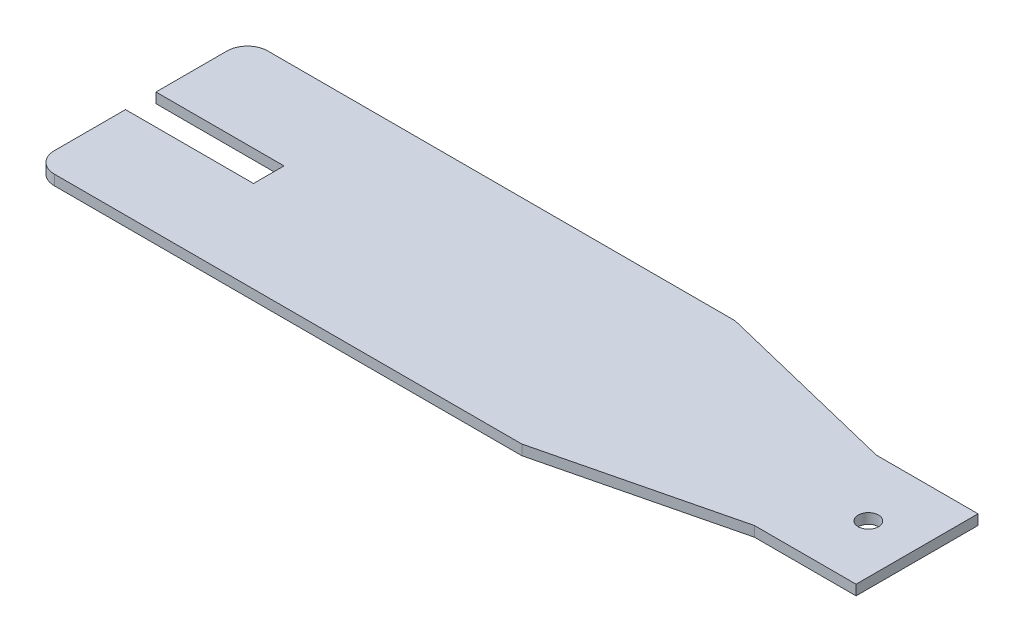
ISO-10303-21;
HEADER;
FILE_DESCRIPTION(('STEP AP214'),'2;1');
FILE_NAME('part.step','',(''),(''),'','','');
FILE_SCHEMA(('AUTOMOTIVE_DESIGN { 1 0 10303 214 1 1 1 1 }'));
ENDSEC;
DATA;
#1=APPLICATION_CONTEXT('core data for automotive mechanical design processes');
#2=APPLICATION_PROTOCOL_DEFINITION('international standard','automotive_design',2000,#1);
#3=PRODUCT_CONTEXT('',#1,'mechanical');
#4=PRODUCT('Part','Part','',(#3));
#5=PRODUCT_RELATED_PRODUCT_CATEGORY('part','',(#4));
#6=PRODUCT_DEFINITION_FORMATION('','',#4);
#7=PRODUCT_DEFINITION_CONTEXT('part definition',#1,'design');
#8=PRODUCT_DEFINITION('design','',#6,#7);
#9=PRODUCT_DEFINITION_SHAPE('','',#8);
#10=(LENGTH_UNIT() NAMED_UNIT(*) SI_UNIT(.MILLI.,.METRE.));
#11=(NAMED_UNIT(*) PLANE_ANGLE_UNIT() SI_UNIT($,.RADIAN.));
#12=(NAMED_UNIT(*) SI_UNIT($,.STERADIAN.) SOLID_ANGLE_UNIT());
#13=UNCERTAINTY_MEASURE_WITH_UNIT(LENGTH_MEASURE(1.E-05),#10,'distance_accuracy_value','');
#14=(GEOMETRIC_REPRESENTATION_CONTEXT(3) GLOBAL_UNCERTAINTY_ASSIGNED_CONTEXT((#13)) GLOBAL_UNIT_ASSIGNED_CONTEXT((#10,
#11,#12)) REPRESENTATION_CONTEXT('',''));
#15=CARTESIAN_POINT('',(0.,0.,0.));
#16=DIRECTION('',(0.,0.,1.));
#17=DIRECTION('',(1.,0.,0.));
#18=AXIS2_PLACEMENT_3D('',#15,#16,#17);
#19=CARTESIAN_POINT('',(-181.,5.,52.1044776119404));
#20=DIRECTION('',(0.,-1.,0.));
#21=DIRECTION('',(0.,0.,-1.));
#22=AXIS2_PLACEMENT_3D('',#19,#20,#21);
#23=PLANE('',#22);
#24=CARTESIAN_POINT('',(-181.,5.,52.1044776119404));
#25=DIRECTION('',(0.,1.,0.));
#26=DIRECTION('',(0.,0.,-1.));
#27=AXIS2_PLACEMENT_3D('',#24,#25,#26);
#28=CIRCLE('',#27,10.);
#29=CARTESIAN_POINT('',(-191.,5.,52.1044776119404));
#30=VERTEX_POINT('',#29);
#31=CARTESIAN_POINT('',(-181.,5.,62.1044776119404));
#32=VERTEX_POINT('',#31);
#33=EDGE_CURVE('E218',#30,#32,#28,.T.);
#34=ORIENTED_EDGE('',*,*,#33,.T.);
#35=DIRECTION('',(1.,0.,0.));
#36=VECTOR('',#35,1.);
#37=CARTESIAN_POINT('',(49.0000000000002,5.,62.1044776119404));
#38=LINE('',#37,#36);
#39=CARTESIAN_POINT('',(49.0000000000002,5.,62.1044776119404));
#40=VERTEX_POINT('',#39);
#41=EDGE_CURVE('E118',#32,#40,#38,.T.);
#42=ORIENTED_EDGE('',*,*,#41,.T.);
#43=DIRECTION('',(0.971371940007968,0.,-0.237563789675862));
#44=VECTOR('',#43,1.);
#45=CARTESIAN_POINT('',(141.,5.,39.6044776119404));
#46=LINE('',#45,#44);
#47=CARTESIAN_POINT('',(141.,5.,39.6044776119404));
#48=VERTEX_POINT('',#47);
#49=EDGE_CURVE('E263',#40,#48,#46,.T.);
#50=ORIENTED_EDGE('',*,*,#49,.T.);
#51=DIRECTION('',(1.,0.,0.));
#52=VECTOR('',#51,1.);
#53=CARTESIAN_POINT('',(191.,5.,39.6044776119404));
#54=LINE('',#53,#52);
#55=CARTESIAN_POINT('',(191.,5.,39.6044776119404));
#56=VERTEX_POINT('',#55);
#57=EDGE_CURVE('E283',#48,#56,#54,.T.);
#58=ORIENTED_EDGE('',*,*,#57,.T.);
#59=DIRECTION('',(0.,0.,-1.));
#60=VECTOR('',#59,1.);
#61=CARTESIAN_POINT('',(191.,5.,39.6044776119404));
#62=LINE('',#61,#60);
#63=CARTESIAN_POINT('',(191.,5.,-20.3955223880596));
#64=VERTEX_POINT('',#63);
#65=EDGE_CURVE('E279',#56,#64,#62,.T.);
#66=ORIENTED_EDGE('',*,*,#65,.T.);
#67=DIRECTION('',(-1.,0.,0.));
#68=VECTOR('',#67,1.);
#69=CARTESIAN_POINT('',(191.,5.,-20.3955223880596));
#70=LINE('',#69,#68);
#71=CARTESIAN_POINT('',(141.,5.,-20.3955223880596));
#72=VERTEX_POINT('',#71);
#73=EDGE_CURVE('E282',#64,#72,#70,.T.);
#74=ORIENTED_EDGE('',*,*,#73,.T.);
#75=DIRECTION('',(-0.971371940007968,0.,-0.237563789675862));
#76=VECTOR('',#75,1.);
#77=CARTESIAN_POINT('',(141.,5.,-20.3955223880596));
#78=LINE('',#77,#76);
#79=CARTESIAN_POINT('',(49.0000000000002,5.,-42.8955223880596));
#80=VERTEX_POINT('',#79);
#81=EDGE_CURVE('E287',#72,#80,#78,.T.);
#82=ORIENTED_EDGE('',*,*,#81,.T.);
#83=DIRECTION('',(-1.,0.,0.));
#84=VECTOR('',#83,1.);
#85=CARTESIAN_POINT('',(49.0000000000002,5.,-42.8955223880596));
#86=LINE('',#85,#84);
#87=CARTESIAN_POINT('',(-181.,5.,-42.8955223880596));
#88=VERTEX_POINT('',#87);
#89=EDGE_CURVE('E294',#80,#88,#86,.T.);
#90=ORIENTED_EDGE('',*,*,#89,.T.);
#91=CARTESIAN_POINT('',(-181.,5.,-32.8955223880596));
#92=DIRECTION('',(0.,1.,0.));
#93=DIRECTION('',(0.,0.,1.));
#94=AXIS2_PLACEMENT_3D('',#91,#92,#93);
#95=CIRCLE('',#94,10.);
#96=CARTESIAN_POINT('',(-191.,5.,-32.8955223880596));
#97=VERTEX_POINT('',#96);
#98=EDGE_CURVE('E297',#88,#97,#95,.T.);
#99=ORIENTED_EDGE('',*,*,#98,.T.);
#100=DIRECTION('',(0.,0.,1.));
#101=VECTOR('',#100,1.);
#102=CARTESIAN_POINT('',(-191.,5.,2.10447761194041));
#103=LINE('',#102,#101);
#104=CARTESIAN_POINT('',(-191.,5.,2.10447761194041));
#105=VERTEX_POINT('',#104);
#106=EDGE_CURVE('E300',#97,#105,#103,.T.);
#107=ORIENTED_EDGE('',*,*,#106,.T.);
#108=DIRECTION('',(1.,0.,0.));
#109=VECTOR('',#108,1.);
#110=CARTESIAN_POINT('',(-191.,5.,2.10447761194041));
#111=LINE('',#110,#109);
#112=CARTESIAN_POINT('',(-128.,5.,2.10447761194041));
#113=VERTEX_POINT('',#112);
#114=EDGE_CURVE('E155',#105,#113,#111,.T.);
#115=ORIENTED_EDGE('',*,*,#114,.T.);
#116=DIRECTION('',(0.,0.,1.));
#117=VECTOR('',#116,1.);
#118=CARTESIAN_POINT('',(-128.,5.,2.10447761194041));
#119=LINE('',#118,#117);
#120=CARTESIAN_POINT('',(-128.,5.,17.1044776119404));
#121=VERTEX_POINT('',#120);
#122=EDGE_CURVE('E149',#113,#121,#119,.T.);
#123=ORIENTED_EDGE('',*,*,#122,.T.);
#124=DIRECTION('',(-1.,0.,0.));
#125=VECTOR('',#124,1.);
#126=CARTESIAN_POINT('',(-191.,5.,17.1044776119404));
#127=LINE('',#126,#125);
#128=CARTESIAN_POINT('',(-191.,5.,17.1044776119404));
#129=VERTEX_POINT('',#128);
#130=EDGE_CURVE('E153',#121,#129,#127,.T.);
#131=ORIENTED_EDGE('',*,*,#130,.T.);
#132=DIRECTION('',(0.,0.,1.));
#133=VECTOR('',#132,1.);
#134=CARTESIAN_POINT('',(-191.,5.,52.1044776119404));
#135=LINE('',#134,#133);
#136=EDGE_CURVE('E57',#129,#30,#135,.T.);
#137=ORIENTED_EDGE('',*,*,#136,.T.);
#138=EDGE_LOOP('',(#34,#42,#50,#58,#66,#74,#82,#90,#99,#107,#115,#123,#131,#137));
#139=FACE_BOUND('',#138,.T.);
#140=CARTESIAN_POINT('',(167.053731343284,5.,9.60447761194041));
#141=DIRECTION('',(0.,1.,0.));
#142=DIRECTION('',(0.,0.,1.));
#143=AXIS2_PLACEMENT_3D('',#140,#141,#142);
#144=CIRCLE('',#143,4.99999999999999);
#145=CARTESIAN_POINT('',(167.053731343284,5.,14.6044776119404));
#146=VERTEX_POINT('',#145);
#147=EDGE_CURVE('E182',#146,#146,#144,.T.);
#148=ORIENTED_EDGE('',*,*,#147,.F.);
#149=EDGE_LOOP('',(#148));
#150=FACE_BOUND('',#149,.T.);
#151=ADVANCED_FACE('F39',(#139,#150),#23,.F.);
#152=CARTESIAN_POINT('',(-181.,0.,52.1044776119404));
#153=DIRECTION('',(0.,-1.,0.));
#154=DIRECTION('',(0.,0.,-1.));
#155=AXIS2_PLACEMENT_3D('',#152,#153,#154);
#156=PLANE('',#155);
#157=CARTESIAN_POINT('',(-181.,0.,52.1044776119404));
#158=DIRECTION('',(0.,1.,0.));
#159=DIRECTION('',(0.,0.,-1.));
#160=AXIS2_PLACEMENT_3D('',#157,#158,#159);
#161=CIRCLE('',#160,10.);
#162=CARTESIAN_POINT('',(-191.,0.,52.1044776119404));
#163=VERTEX_POINT('',#162);
#164=CARTESIAN_POINT('',(-181.,0.,62.1044776119404));
#165=VERTEX_POINT('',#164);
#166=EDGE_CURVE('E177',#163,#165,#161,.T.);
#167=ORIENTED_EDGE('',*,*,#166,.F.);
#168=DIRECTION('',(0.,0.,1.));
#169=VECTOR('',#168,1.);
#170=CARTESIAN_POINT('',(-191.,0.,52.1044776119404));
#171=LINE('',#170,#169);
#172=CARTESIAN_POINT('',(-191.,0.,17.1044776119404));
#173=VERTEX_POINT('',#172);
#174=EDGE_CURVE('E110',#173,#163,#171,.T.);
#175=ORIENTED_EDGE('',*,*,#174,.F.);
#176=DIRECTION('',(-1.,0.,0.));
#177=VECTOR('',#176,1.);
#178=CARTESIAN_POINT('',(-191.,0.,17.1044776119404));
#179=LINE('',#178,#177);
#180=CARTESIAN_POINT('',(-128.,0.,17.1044776119404));
#181=VERTEX_POINT('',#180);
#182=EDGE_CURVE('E104',#181,#173,#179,.T.);
#183=ORIENTED_EDGE('',*,*,#182,.F.);
#184=DIRECTION('',(0.,0.,1.));
#185=VECTOR('',#184,1.);
#186=CARTESIAN_POINT('',(-128.,0.,2.10447761194041));
#187=LINE('',#186,#185);
#188=CARTESIAN_POINT('',(-128.,0.,2.10447761194041));
#189=VERTEX_POINT('',#188);
#190=EDGE_CURVE('E164',#189,#181,#187,.T.);
#191=ORIENTED_EDGE('',*,*,#190,.F.);
#192=DIRECTION('',(1.,0.,0.));
#193=VECTOR('',#192,1.);
#194=CARTESIAN_POINT('',(-191.,0.,2.10447761194041));
#195=LINE('',#194,#193);
#196=CARTESIAN_POINT('',(-191.,0.,2.10447761194041));
#197=VERTEX_POINT('',#196);
#198=EDGE_CURVE('E209',#197,#189,#195,.T.);
#199=ORIENTED_EDGE('',*,*,#198,.F.);
#200=DIRECTION('',(0.,0.,1.));
#201=VECTOR('',#200,1.);
#202=CARTESIAN_POINT('',(-191.,0.,2.10447761194041));
#203=LINE('',#202,#201);
#204=CARTESIAN_POINT('',(-191.,0.,-32.8955223880596));
#205=VERTEX_POINT('',#204);
#206=EDGE_CURVE('E206',#205,#197,#203,.T.);
#207=ORIENTED_EDGE('',*,*,#206,.F.);
#208=CARTESIAN_POINT('',(-181.,0.,-32.8955223880596));
#209=DIRECTION('',(0.,1.,0.));
#210=DIRECTION('',(0.,0.,1.));
#211=AXIS2_PLACEMENT_3D('',#208,#209,#210);
#212=CIRCLE('',#211,10.);
#213=CARTESIAN_POINT('',(-181.,0.,-42.8955223880596));
#214=VERTEX_POINT('',#213);
#215=EDGE_CURVE('E203',#214,#205,#212,.T.);
#216=ORIENTED_EDGE('',*,*,#215,.F.);
#217=DIRECTION('',(-1.,0.,0.));
#218=VECTOR('',#217,1.);
#219=CARTESIAN_POINT('',(49.0000000000002,0.,-42.8955223880596));
#220=LINE('',#219,#218);
#221=CARTESIAN_POINT('',(49.0000000000002,0.,-42.8955223880596));
#222=VERTEX_POINT('',#221);
#223=EDGE_CURVE('E200',#222,#214,#220,.T.);
#224=ORIENTED_EDGE('',*,*,#223,.F.);
#225=DIRECTION('',(-0.971371940007968,0.,-0.237563789675862));
#226=VECTOR('',#225,1.);
#227=CARTESIAN_POINT('',(141.,0.,-20.3955223880596));
#228=LINE('',#227,#226);
#229=CARTESIAN_POINT('',(141.,0.,-20.3955223880596));
#230=VERTEX_POINT('',#229);
#231=EDGE_CURVE('E197',#230,#222,#228,.T.);
#232=ORIENTED_EDGE('',*,*,#231,.F.);
#233=DIRECTION('',(-1.,0.,0.));
#234=VECTOR('',#233,1.);
#235=CARTESIAN_POINT('',(191.,0.,-20.3955223880596));
#236=LINE('',#235,#234);
#237=CARTESIAN_POINT('',(191.,0.,-20.3955223880596));
#238=VERTEX_POINT('',#237);
#239=EDGE_CURVE('E194',#238,#230,#236,.T.);
#240=ORIENTED_EDGE('',*,*,#239,.F.);
#241=DIRECTION('',(0.,0.,-1.));
#242=VECTOR('',#241,1.);
#243=CARTESIAN_POINT('',(191.,0.,39.6044776119404));
#244=LINE('',#243,#242);
#245=CARTESIAN_POINT('',(191.,0.,39.6044776119404));
#246=VERTEX_POINT('',#245);
#247=EDGE_CURVE('E191',#246,#238,#244,.T.);
#248=ORIENTED_EDGE('',*,*,#247,.F.);
#249=DIRECTION('',(1.,0.,0.));
#250=VECTOR('',#249,1.);
#251=CARTESIAN_POINT('',(191.,0.,39.6044776119404));
#252=LINE('',#251,#250);
#253=CARTESIAN_POINT('',(141.,0.,39.6044776119404));
#254=VERTEX_POINT('',#253);
#255=EDGE_CURVE('E188',#254,#246,#252,.T.);
#256=ORIENTED_EDGE('',*,*,#255,.F.);
#257=DIRECTION('',(0.971371940007968,0.,-0.237563789675862));
#258=VECTOR('',#257,1.);
#259=CARTESIAN_POINT('',(141.,0.,39.6044776119404));
#260=LINE('',#259,#258);
#261=CARTESIAN_POINT('',(49.0000000000002,0.,62.1044776119404));
#262=VERTEX_POINT('',#261);
#263=EDGE_CURVE('E185',#262,#254,#260,.T.);
#264=ORIENTED_EDGE('',*,*,#263,.F.);
#265=DIRECTION('',(1.,0.,0.));
#266=VECTOR('',#265,1.);
#267=CARTESIAN_POINT('',(49.0000000000002,0.,62.1044776119404));
#268=LINE('',#267,#266);
#269=EDGE_CURVE('E181',#165,#262,#268,.T.);
#270=ORIENTED_EDGE('',*,*,#269,.F.);
#271=EDGE_LOOP('',(#167,#175,#183,#191,#199,#207,#216,#224,#232,#240,#248,#256,#264,#270));
#272=FACE_BOUND('',#271,.T.);
#273=CARTESIAN_POINT('',(167.053731343284,0.,9.60447761194041));
#274=DIRECTION('',(0.,1.,0.));
#275=DIRECTION('',(0.,0.,1.));
#276=AXIS2_PLACEMENT_3D('',#273,#274,#275);
#277=CIRCLE('',#276,4.99999999999999);
#278=CARTESIAN_POINT('',(167.053731343284,0.,14.6044776119404));
#279=VERTEX_POINT('',#278);
#280=EDGE_CURVE('E475',#279,#279,#277,.T.);
#281=ORIENTED_EDGE('',*,*,#280,.T.);
#282=EDGE_LOOP('',(#281));
#283=FACE_BOUND('',#282,.T.);
#284=ADVANCED_FACE('F267',(#272,#283),#156,.T.);
#285=CARTESIAN_POINT('',(-181.,5.,52.1044776119404));
#286=DIRECTION('',(0.,-1.,0.));
#287=DIRECTION('',(0.,0.,-1.));
#288=AXIS2_PLACEMENT_3D('',#285,#286,#287);
#289=CYLINDRICAL_SURFACE('',#288,10.);
#290=ORIENTED_EDGE('',*,*,#166,.T.);
#291=DIRECTION('',(0.,-1.,0.));
#292=VECTOR('',#291,1.);
#293=CARTESIAN_POINT('',(-181.,5.,62.1044776119404));
#294=LINE('',#293,#292);
#295=EDGE_CURVE('E11',#32,#165,#294,.T.);
#296=ORIENTED_EDGE('',*,*,#295,.F.);
#297=ORIENTED_EDGE('',*,*,#33,.F.);
#298=DIRECTION('',(0.,-1.,0.));
#299=VECTOR('',#298,1.);
#300=CARTESIAN_POINT('',(-191.,5.,52.1044776119404));
#301=LINE('',#300,#299);
#302=EDGE_CURVE('E173',#30,#163,#301,.T.);
#303=ORIENTED_EDGE('',*,*,#302,.T.);
#304=EDGE_LOOP('',(#290,#296,#297,#303));
#305=FACE_BOUND('',#304,.T.);
#306=ADVANCED_FACE('F41',(#305),#289,.T.);
#307=CARTESIAN_POINT('',(49.0000000000002,5.,62.1044776119404));
#308=DIRECTION('',(0.,0.,-1.));
#309=DIRECTION('',(-1.,0.,0.));
#310=AXIS2_PLACEMENT_3D('',#307,#308,#309);
#311=PLANE('',#310);
#312=ORIENTED_EDGE('',*,*,#269,.T.);
#313=DIRECTION('',(0.,-1.,0.));
#314=VECTOR('',#313,1.);
#315=CARTESIAN_POINT('',(49.0000000000002,5.,62.1044776119404));
#316=LINE('',#315,#314);
#317=EDGE_CURVE('E49',#40,#262,#316,.T.);
#318=ORIENTED_EDGE('',*,*,#317,.F.);
#319=ORIENTED_EDGE('',*,*,#41,.F.);
#320=ORIENTED_EDGE('',*,*,#295,.T.);
#321=EDGE_LOOP('',(#312,#318,#319,#320));
#322=FACE_BOUND('',#321,.T.);
#323=ADVANCED_FACE('F336',(#322),#311,.F.);
#324=CARTESIAN_POINT('',(141.,5.,39.6044776119404));
#325=DIRECTION('',(-0.237563789675862,0.,-0.971371940007968));
#326=DIRECTION('',(-0.971371940007968,0.,0.237563789675862));
#327=AXIS2_PLACEMENT_3D('',#324,#325,#326);
#328=PLANE('',#327);
#329=ORIENTED_EDGE('',*,*,#263,.T.);
#330=DIRECTION('',(0.,-1.,0.));
#331=VECTOR('',#330,1.);
#332=CARTESIAN_POINT('',(141.,5.,39.6044776119404));
#333=LINE('',#332,#331);
#334=EDGE_CURVE('E253',#48,#254,#333,.T.);
#335=ORIENTED_EDGE('',*,*,#334,.F.);
#336=ORIENTED_EDGE('',*,*,#49,.F.);
#337=ORIENTED_EDGE('',*,*,#317,.T.);
#338=EDGE_LOOP('',(#329,#335,#336,#337));
#339=FACE_BOUND('',#338,.T.);
#340=ADVANCED_FACE('F261',(#339),#328,.F.);
#341=CARTESIAN_POINT('',(191.,5.,39.6044776119404));
#342=DIRECTION('',(0.,0.,-1.));
#343=DIRECTION('',(-1.,0.,0.));
#344=AXIS2_PLACEMENT_3D('',#341,#342,#343);
#345=PLANE('',#344);
#346=ORIENTED_EDGE('',*,*,#255,.T.);
#347=DIRECTION('',(0.,-1.,0.));
#348=VECTOR('',#347,1.);
#349=CARTESIAN_POINT('',(191.,5.,39.6044776119404));
#350=LINE('',#349,#348);
#351=EDGE_CURVE('E249',#56,#246,#350,.T.);
#352=ORIENTED_EDGE('',*,*,#351,.F.);
#353=ORIENTED_EDGE('',*,*,#57,.F.);
#354=ORIENTED_EDGE('',*,*,#334,.T.);
#355=EDGE_LOOP('',(#346,#352,#353,#354));
#356=FACE_BOUND('',#355,.T.);
#357=ADVANCED_FACE('F273',(#356),#345,.F.);
#358=CARTESIAN_POINT('',(191.,5.,39.6044776119404));
#359=DIRECTION('',(-1.,0.,0.));
#360=DIRECTION('',(0.,0.,1.));
#361=AXIS2_PLACEMENT_3D('',#358,#359,#360);
#362=PLANE('',#361);
#363=ORIENTED_EDGE('',*,*,#247,.T.);
#364=DIRECTION('',(0.,-1.,0.));
#365=VECTOR('',#364,1.);
#366=CARTESIAN_POINT('',(191.,5.,-20.3955223880596));
#367=LINE('',#366,#365);
#368=EDGE_CURVE('E245',#64,#238,#367,.T.);
#369=ORIENTED_EDGE('',*,*,#368,.F.);
#370=ORIENTED_EDGE('',*,*,#65,.F.);
#371=ORIENTED_EDGE('',*,*,#351,.T.);
#372=EDGE_LOOP('',(#363,#369,#370,#371));
#373=FACE_BOUND('',#372,.T.);
#374=ADVANCED_FACE('F277',(#373),#362,.F.);
#375=CARTESIAN_POINT('',(191.,5.,-20.3955223880596));
#376=DIRECTION('',(0.,0.,1.));
#377=DIRECTION('',(1.,0.,0.));
#378=AXIS2_PLACEMENT_3D('',#375,#376,#377);
#379=PLANE('',#378);
#380=ORIENTED_EDGE('',*,*,#239,.T.);
#381=DIRECTION('',(0.,-1.,0.));
#382=VECTOR('',#381,1.);
#383=CARTESIAN_POINT('',(141.,5.,-20.3955223880596));
#384=LINE('',#383,#382);
#385=EDGE_CURVE('E241',#72,#230,#384,.T.);
#386=ORIENTED_EDGE('',*,*,#385,.F.);
#387=ORIENTED_EDGE('',*,*,#73,.F.);
#388=ORIENTED_EDGE('',*,*,#368,.T.);
#389=EDGE_LOOP('',(#380,#386,#387,#388));
#390=FACE_BOUND('',#389,.T.);
#391=ADVANCED_FACE('F349',(#390),#379,.F.);
#392=CARTESIAN_POINT('',(141.,5.,-20.3955223880596));
#393=DIRECTION('',(-0.237563789675862,0.,0.971371940007968));
#394=DIRECTION('',(0.971371940007968,0.,0.237563789675862));
#395=AXIS2_PLACEMENT_3D('',#392,#393,#394);
#396=PLANE('',#395);
#397=ORIENTED_EDGE('',*,*,#231,.T.);
#398=DIRECTION('',(0.,-1.,0.));
#399=VECTOR('',#398,1.);
#400=CARTESIAN_POINT('',(49.0000000000002,5.,-42.8955223880596));
#401=LINE('',#400,#399);
#402=EDGE_CURVE('E237',#80,#222,#401,.T.);
#403=ORIENTED_EDGE('',*,*,#402,.F.);
#404=ORIENTED_EDGE('',*,*,#81,.F.);
#405=ORIENTED_EDGE('',*,*,#385,.T.);
#406=EDGE_LOOP('',(#397,#403,#404,#405));
#407=FACE_BOUND('',#406,.T.);
#408=ADVANCED_FACE('F352',(#407),#396,.F.);
#409=CARTESIAN_POINT('',(49.0000000000002,5.,-42.8955223880596));
#410=DIRECTION('',(0.,0.,1.));
#411=DIRECTION('',(1.,0.,0.));
#412=AXIS2_PLACEMENT_3D('',#409,#410,#411);
#413=PLANE('',#412);
#414=ORIENTED_EDGE('',*,*,#223,.T.);
#415=DIRECTION('',(0.,-1.,0.));
#416=VECTOR('',#415,1.);
#417=CARTESIAN_POINT('',(-181.,5.,-42.8955223880596));
#418=LINE('',#417,#416);
#419=EDGE_CURVE('E233',#88,#214,#418,.T.);
#420=ORIENTED_EDGE('',*,*,#419,.F.);
#421=ORIENTED_EDGE('',*,*,#89,.F.);
#422=ORIENTED_EDGE('',*,*,#402,.T.);
#423=EDGE_LOOP('',(#414,#420,#421,#422));
#424=FACE_BOUND('',#423,.T.);
#425=ADVANCED_FACE('F356',(#424),#413,.F.);
#426=CARTESIAN_POINT('',(-181.,5.,-32.8955223880596));
#427=DIRECTION('',(0.,-1.,0.));
#428=DIRECTION('',(0.,0.,-1.));
#429=AXIS2_PLACEMENT_3D('',#426,#427,#428);
#430=CYLINDRICAL_SURFACE('',#429,10.);
#431=ORIENTED_EDGE('',*,*,#215,.T.);
#432=DIRECTION('',(0.,-1.,0.));
#433=VECTOR('',#432,1.);
#434=CARTESIAN_POINT('',(-191.,5.,-32.8955223880596));
#435=LINE('',#434,#433);
#436=EDGE_CURVE('E229',#97,#205,#435,.T.);
#437=ORIENTED_EDGE('',*,*,#436,.F.);
#438=ORIENTED_EDGE('',*,*,#98,.F.);
#439=ORIENTED_EDGE('',*,*,#419,.T.);
#440=EDGE_LOOP('',(#431,#437,#438,#439));
#441=FACE_BOUND('',#440,.T.);
#442=ADVANCED_FACE('F360',(#441),#430,.T.);
#443=CARTESIAN_POINT('',(-191.,5.,2.10447761194041));
#444=DIRECTION('',(1.,0.,0.));
#445=DIRECTION('',(0.,0.,-1.));
#446=AXIS2_PLACEMENT_3D('',#443,#444,#445);
#447=PLANE('',#446);
#448=ORIENTED_EDGE('',*,*,#206,.T.);
#449=DIRECTION('',(0.,-1.,0.));
#450=VECTOR('',#449,1.);
#451=CARTESIAN_POINT('',(-191.,5.,2.10447761194041));
#452=LINE('',#451,#450);
#453=EDGE_CURVE('E225',#105,#197,#452,.T.);
#454=ORIENTED_EDGE('',*,*,#453,.F.);
#455=ORIENTED_EDGE('',*,*,#106,.F.);
#456=ORIENTED_EDGE('',*,*,#436,.T.);
#457=EDGE_LOOP('',(#448,#454,#455,#456));
#458=FACE_BOUND('',#457,.T.);
#459=ADVANCED_FACE('F308',(#458),#447,.F.);
#460=CARTESIAN_POINT('',(-191.,5.,2.10447761194041));
#461=DIRECTION('',(0.,0.,-1.));
#462=DIRECTION('',(-1.,0.,0.));
#463=AXIS2_PLACEMENT_3D('',#460,#461,#462);
#464=PLANE('',#463);
#465=ORIENTED_EDGE('',*,*,#198,.T.);
#466=DIRECTION('',(0.,-1.,0.));
#467=VECTOR('',#466,1.);
#468=CARTESIAN_POINT('',(-128.,5.,2.10447761194041));
#469=LINE('',#468,#467);
#470=EDGE_CURVE('E166',#113,#189,#469,.T.);
#471=ORIENTED_EDGE('',*,*,#470,.F.);
#472=ORIENTED_EDGE('',*,*,#114,.F.);
#473=ORIENTED_EDGE('',*,*,#453,.T.);
#474=EDGE_LOOP('',(#465,#471,#472,#473));
#475=FACE_BOUND('',#474,.T.);
#476=ADVANCED_FACE('F312',(#475),#464,.F.);
#477=CARTESIAN_POINT('',(-128.,5.,2.10447761194041));
#478=DIRECTION('',(1.,0.,0.));
#479=DIRECTION('',(0.,0.,-1.));
#480=AXIS2_PLACEMENT_3D('',#477,#478,#479);
#481=PLANE('',#480);
#482=ORIENTED_EDGE('',*,*,#190,.T.);
#483=DIRECTION('',(0.,-1.,0.));
#484=VECTOR('',#483,1.);
#485=CARTESIAN_POINT('',(-128.,5.,17.1044776119404));
#486=LINE('',#485,#484);
#487=EDGE_CURVE('E161',#121,#181,#486,.T.);
#488=ORIENTED_EDGE('',*,*,#487,.F.);
#489=ORIENTED_EDGE('',*,*,#122,.F.);
#490=ORIENTED_EDGE('',*,*,#470,.T.);
#491=EDGE_LOOP('',(#482,#488,#489,#490));
#492=FACE_BOUND('',#491,.T.);
#493=ADVANCED_FACE('F162',(#492),#481,.F.);
#494=CARTESIAN_POINT('',(-191.,5.,17.1044776119404));
#495=DIRECTION('',(0.,0.,1.));
#496=DIRECTION('',(1.,0.,0.));
#497=AXIS2_PLACEMENT_3D('',#494,#495,#496);
#498=PLANE('',#497);
#499=ORIENTED_EDGE('',*,*,#182,.T.);
#500=DIRECTION('',(0.,-1.,0.));
#501=VECTOR('',#500,1.);
#502=CARTESIAN_POINT('',(-191.,5.,17.1044776119404));
#503=LINE('',#502,#501);
#504=EDGE_CURVE('E167',#129,#173,#503,.T.);
#505=ORIENTED_EDGE('',*,*,#504,.F.);
#506=ORIENTED_EDGE('',*,*,#130,.F.);
#507=ORIENTED_EDGE('',*,*,#487,.T.);
#508=EDGE_LOOP('',(#499,#505,#506,#507));
#509=FACE_BOUND('',#508,.T.);
#510=ADVANCED_FACE('F169',(#509),#498,.F.);
#511=CARTESIAN_POINT('',(-191.,5.,52.1044776119404));
#512=DIRECTION('',(1.,0.,0.));
#513=DIRECTION('',(0.,0.,-1.));
#514=AXIS2_PLACEMENT_3D('',#511,#512,#513);
#515=PLANE('',#514);
#516=ORIENTED_EDGE('',*,*,#174,.T.);
#517=ORIENTED_EDGE('',*,*,#302,.F.);
#518=ORIENTED_EDGE('',*,*,#136,.F.);
#519=ORIENTED_EDGE('',*,*,#504,.T.);
#520=EDGE_LOOP('',(#516,#517,#518,#519));
#521=FACE_BOUND('',#520,.T.);
#522=ADVANCED_FACE('F316',(#521),#515,.F.);
#523=CARTESIAN_POINT('',(167.053731343284,5.,9.60447761194041));
#524=DIRECTION('',(0.,-1.,0.));
#525=DIRECTION('',(0.,0.,-1.));
#526=AXIS2_PLACEMENT_3D('',#523,#524,#525);
#527=CYLINDRICAL_SURFACE('',#526,4.99999999999999);
#528=ORIENTED_EDGE('',*,*,#147,.T.);
#529=EDGE_LOOP('',(#528));
#530=FACE_BOUND('',#529,.T.);
#531=ORIENTED_EDGE('',*,*,#280,.F.);
#532=EDGE_LOOP('',(#531));
#533=FACE_BOUND('',#532,.T.);
#534=ADVANCED_FACE('F318',(#530,#533),#527,.F.);
#535=CLOSED_SHELL('',(#151,#284,#306,#323,#340,#357,#374,#391,#408,#425,#442,#459,#476,#493,
#510,#522,#534));
#536=MANIFOLD_SOLID_BREP('B2',#535);
#537=ADVANCED_BREP_SHAPE_REPRESENTATION('',(#18,#536),#14);
#538=SHAPE_DEFINITION_REPRESENTATION(#9,#537);
ENDSEC;
END-ISO-10303-21;
